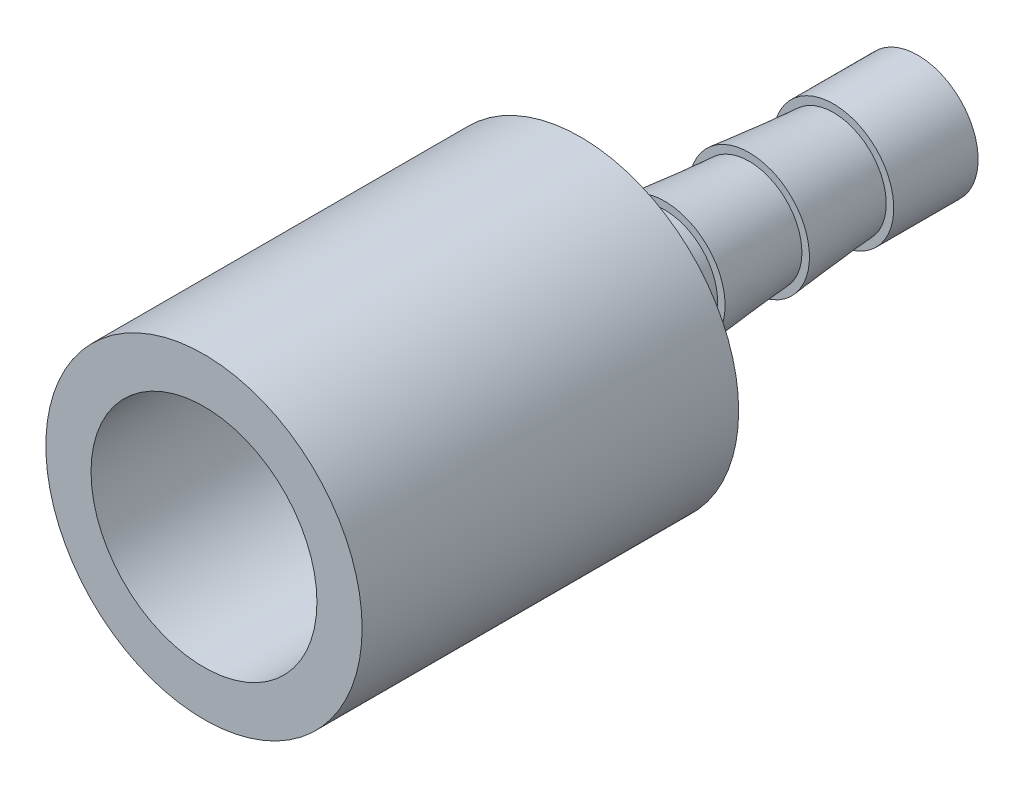
ISO-10303-21;
HEADER;
FILE_DESCRIPTION(('STEP AP214'),'2;1');
FILE_NAME('part.step','',(''),(''),'','','');
FILE_SCHEMA(('AUTOMOTIVE_DESIGN { 1 0 10303 214 1 1 1 1 }'));
ENDSEC;
DATA;
#1=APPLICATION_CONTEXT('core data for automotive mechanical design processes');
#2=APPLICATION_PROTOCOL_DEFINITION('international standard','automotive_design',2000,#1);
#3=PRODUCT_CONTEXT('',#1,'mechanical');
#4=PRODUCT('Part','Part','',(#3));
#5=PRODUCT_RELATED_PRODUCT_CATEGORY('part','',(#4));
#6=PRODUCT_DEFINITION_FORMATION('','',#4);
#7=PRODUCT_DEFINITION_CONTEXT('part definition',#1,'design');
#8=PRODUCT_DEFINITION('design','',#6,#7);
#9=PRODUCT_DEFINITION_SHAPE('','',#8);
#10=(LENGTH_UNIT() NAMED_UNIT(*) SI_UNIT(.MILLI.,.METRE.));
#11=(NAMED_UNIT(*) PLANE_ANGLE_UNIT() SI_UNIT($,.RADIAN.));
#12=(NAMED_UNIT(*) SI_UNIT($,.STERADIAN.) SOLID_ANGLE_UNIT());
#13=UNCERTAINTY_MEASURE_WITH_UNIT(LENGTH_MEASURE(1.E-05),#10,'distance_accuracy_value','');
#14=(GEOMETRIC_REPRESENTATION_CONTEXT(3) GLOBAL_UNCERTAINTY_ASSIGNED_CONTEXT((#13)) GLOBAL_UNIT_ASSIGNED_CONTEXT((#10,
#11,#12)) REPRESENTATION_CONTEXT('',''));
#15=CARTESIAN_POINT('',(0.,0.,0.));
#16=DIRECTION('',(0.,0.,1.));
#17=DIRECTION('',(1.,0.,0.));
#18=AXIS2_PLACEMENT_3D('',#15,#16,#17);
#19=CARTESIAN_POINT('',(0.,0.,25.));
#20=DIRECTION('',(0.,0.,-1.));
#21=DIRECTION('',(-1.,0.,0.));
#22=AXIS2_PLACEMENT_3D('',#19,#20,#21);
#23=CYLINDRICAL_SURFACE('',#22,7.5);
#24=CARTESIAN_POINT('',(0.,0.,25.));
#25=DIRECTION('',(0.,0.,1.));
#26=DIRECTION('',(1.,0.,0.));
#27=AXIS2_PLACEMENT_3D('',#24,#25,#26);
#28=CIRCLE('',#27,7.5);
#29=CARTESIAN_POINT('',(7.5,0.,25.));
#30=VERTEX_POINT('',#29);
#31=EDGE_CURVE('E58',#30,#30,#28,.T.);
#32=ORIENTED_EDGE('',*,*,#31,.T.);
#33=EDGE_LOOP('',(#32));
#34=FACE_BOUND('',#33,.T.);
#35=CARTESIAN_POINT('',(0.,0.,5.));
#36=DIRECTION('',(0.,0.,-1.));
#37=DIRECTION('',(-1.,0.,0.));
#38=AXIS2_PLACEMENT_3D('',#35,#36,#37);
#39=CIRCLE('',#38,7.5);
#40=CARTESIAN_POINT('',(-7.5,0.,5.));
#41=VERTEX_POINT('',#40);
#42=EDGE_CURVE('E63',#41,#41,#39,.T.);
#43=ORIENTED_EDGE('',*,*,#42,.T.);
#44=EDGE_LOOP('',(#43));
#45=FACE_BOUND('',#44,.T.);
#46=ADVANCED_FACE('F43',(#34,#45),#23,.F.);
#47=CARTESIAN_POINT('',(0.,0.,25.));
#48=DIRECTION('',(0.,0.,1.));
#49=DIRECTION('',(1.,0.,0.));
#50=AXIS2_PLACEMENT_3D('',#47,#48,#49);
#51=PLANE('',#50);
#52=CARTESIAN_POINT('',(0.,0.,25.));
#53=DIRECTION('',(0.,0.,1.));
#54=DIRECTION('',(1.,0.,0.));
#55=AXIS2_PLACEMENT_3D('',#52,#53,#54);
#56=CIRCLE('',#55,10.5);
#57=CARTESIAN_POINT('',(10.5,0.,25.));
#58=VERTEX_POINT('',#57);
#59=EDGE_CURVE('E11',#58,#58,#56,.T.);
#60=ORIENTED_EDGE('',*,*,#59,.T.);
#61=EDGE_LOOP('',(#60));
#62=FACE_BOUND('',#61,.T.);
#63=ORIENTED_EDGE('',*,*,#31,.F.);
#64=EDGE_LOOP('',(#63));
#65=FACE_BOUND('',#64,.T.);
#66=ADVANCED_FACE('F137',(#62,#65),#51,.T.);
#67=CARTESIAN_POINT('',(0.,0.,0.));
#68=DIRECTION('',(0.,0.,1.));
#69=DIRECTION('',(1.,0.,0.));
#70=AXIS2_PLACEMENT_3D('',#67,#68,#69);
#71=PLANE('',#70);
#72=CARTESIAN_POINT('',(0.,0.,0.));
#73=DIRECTION('',(0.,0.,-1.));
#74=DIRECTION('',(-1.,0.,0.));
#75=AXIS2_PLACEMENT_3D('',#72,#73,#74);
#76=CIRCLE('',#75,4.);
#77=CARTESIAN_POINT('',(-3.7218749285493,1.46548524940927,0.));
#78=VERTEX_POINT('',#77);
#79=EDGE_CURVE('E72',#78,#78,#76,.T.);
#80=ORIENTED_EDGE('',*,*,#79,.F.);
#81=EDGE_LOOP('',(#80));
#82=FACE_BOUND('',#81,.T.);
#83=CARTESIAN_POINT('',(0.,0.,0.));
#84=DIRECTION('',(0.,0.,1.));
#85=DIRECTION('',(1.,0.,0.));
#86=AXIS2_PLACEMENT_3D('',#83,#84,#85);
#87=CIRCLE('',#86,10.5);
#88=CARTESIAN_POINT('',(10.5,0.,0.));
#89=VERTEX_POINT('',#88);
#90=EDGE_CURVE('E52',#89,#89,#87,.T.);
#91=ORIENTED_EDGE('',*,*,#90,.F.);
#92=EDGE_LOOP('',(#91));
#93=FACE_BOUND('',#92,.T.);
#94=ADVANCED_FACE('F140',(#82,#93),#71,.F.);
#95=CARTESIAN_POINT('',(0.,0.,25.));
#96=DIRECTION('',(0.,0.,-1.));
#97=DIRECTION('',(-1.,0.,0.));
#98=AXIS2_PLACEMENT_3D('',#95,#96,#97);
#99=CYLINDRICAL_SURFACE('',#98,10.5);
#100=ORIENTED_EDGE('',*,*,#59,.F.);
#101=EDGE_LOOP('',(#100));
#102=FACE_BOUND('',#101,.T.);
#103=ORIENTED_EDGE('',*,*,#90,.T.);
#104=EDGE_LOOP('',(#103));
#105=FACE_BOUND('',#104,.T.);
#106=ADVANCED_FACE('F45',(#102,#105),#99,.T.);
#107=CARTESIAN_POINT('',(0.,0.,5.));
#108=DIRECTION('',(0.,0.,-1.));
#109=DIRECTION('',(-1.,0.,0.));
#110=AXIS2_PLACEMENT_3D('',#107,#108,#109);
#111=PLANE('',#110);
#112=CARTESIAN_POINT('',(0.,0.,5.));
#113=DIRECTION('',(0.,0.,-1.));
#114=DIRECTION('',(-1.,0.,0.));
#115=AXIS2_PLACEMENT_3D('',#112,#113,#114);
#116=CIRCLE('',#115,2.5);
#117=CARTESIAN_POINT('',(-2.5,0.,5.));
#118=VERTEX_POINT('',#117);
#119=EDGE_CURVE('E67',#118,#118,#116,.T.);
#120=ORIENTED_EDGE('',*,*,#119,.T.);
#121=EDGE_LOOP('',(#120));
#122=FACE_BOUND('',#121,.T.);
#123=ORIENTED_EDGE('',*,*,#42,.F.);
#124=EDGE_LOOP('',(#123));
#125=FACE_BOUND('',#124,.T.);
#126=ADVANCED_FACE('F130',(#122,#125),#111,.F.);
#127=CARTESIAN_POINT('',(0.,0.,5.));
#128=DIRECTION('',(0.,0.,-1.));
#129=DIRECTION('',(-1.,0.,0.));
#130=AXIS2_PLACEMENT_3D('',#127,#128,#129);
#131=CYLINDRICAL_SURFACE('',#130,2.5);
#132=ORIENTED_EDGE('',*,*,#119,.F.);
#133=EDGE_LOOP('',(#132));
#134=FACE_BOUND('',#133,.T.);
#135=CARTESIAN_POINT('',(0.,0.,0.));
#136=DIRECTION('',(0.,0.,-1.));
#137=DIRECTION('',(-1.,0.,0.));
#138=AXIS2_PLACEMENT_3D('',#135,#136,#137);
#139=CIRCLE('',#138,2.5);
#140=CARTESIAN_POINT('',(-2.5,0.,0.));
#141=VERTEX_POINT('',#140);
#142=EDGE_CURVE('E68',#141,#141,#139,.T.);
#143=ORIENTED_EDGE('',*,*,#142,.T.);
#144=EDGE_LOOP('',(#143));
#145=FACE_BOUND('',#144,.T.);
#146=ADVANCED_FACE('F118',(#134,#145),#131,.F.);
#147=CARTESIAN_POINT('',(-2.89824660862792,1.96218413905953,-5.6));
#148=CARTESIAN_POINT('',(-3.7218749285493,1.46548524940927,0.));
#149=CARTESIAN_POINT('',(-6.82261488674697,-3.8343090781963,-5.6));
#150=CARTESIAN_POINT('',(-6.65284542736783,-5.97826460768933,0.));
#151=CARTESIAN_POINT('',(-1.02612166949114,-7.75867735631536,-5.6));
#152=CARTESIAN_POINT('',(0.790904429730766,-8.90923510650786,0.));
#153=CARTESIAN_POINT('',(2.89824660862792,-1.96218413905953,-5.6));
#154=CARTESIAN_POINT('',(3.7218749285493,-1.46548524940927,0.));
#155=CARTESIAN_POINT('',(6.82261488674697,3.8343090781963,-5.6));
#156=CARTESIAN_POINT('',(6.65284542736783,5.97826460768933,0.));
#157=CARTESIAN_POINT('',(1.02612166949114,7.75867735631536,-5.6));
#158=CARTESIAN_POINT('',(-0.790904429730765,8.90923510650786,0.));
#159=CARTESIAN_POINT('',(-2.89824660862792,1.96218413905953,-5.6));
#160=CARTESIAN_POINT('',(-3.7218749285493,1.46548524940927,0.));
#161=(BOUNDED_SURFACE() B_SPLINE_SURFACE(3,1,((#147,#148),(#149,#150),(#151,#152),(#153,#154),
(#155,#156),(#157,#158),(#159,#160)),.UNSPECIFIED.,.T.,.F.,.F.) B_SPLINE_SURFACE_WITH_KNOTS((4,
3,4),(2,2),(0.,0.5,1.),(0.,1.),
.UNSPECIFIED.) GEOMETRIC_REPRESENTATION_ITEM() RATIONAL_B_SPLINE_SURFACE(((1.,1.),
(0.333333333333333,0.333333333333333),(0.333333333333333,0.333333333333333),(1.,1.),
(0.333333333333333,0.333333333333333),(0.333333333333333,0.333333333333333),(1.,1.))) REPRESENTATION_ITEM('') SURFACE());
#162=CARTESIAN_POINT('',(0.,0.,-5.6));
#163=DIRECTION('',(0.,0.,-1.));
#164=DIRECTION('',(-1.,0.,0.));
#165=AXIS2_PLACEMENT_3D('',#162,#163,#164);
#166=CIRCLE('',#165,3.5);
#167=CARTESIAN_POINT('',(-2.89824660862792,1.96218413905953,-5.6));
#168=VERTEX_POINT('',#167);
#169=EDGE_CURVE('E79',#168,#168,#166,.T.);
#170=CARTESIAN_POINT('',(-2.89824660862792,1.96218413905953,-5.6));
#171=CARTESIAN_POINT('',(-2.90682607029376,1.95701019229234,-5.54166666666667));
#172=CARTESIAN_POINT('',(-2.91540553195961,1.95183624552515,-5.48333333333333));
#173=CARTESIAN_POINT('',(-2.93256445529131,1.94148835199077,-5.36666666666667));
#174=CARTESIAN_POINT('',(-2.94114391695715,1.93631440522358,-5.30833333333333));
#175=CARTESIAN_POINT('',(-2.95830284028885,1.9259665116892,-5.19166666666667));
#176=CARTESIAN_POINT('',(-2.9668823019547,1.92079256492201,-5.13333333333333));
#177=CARTESIAN_POINT('',(-2.98404122528639,1.91044467138763,-5.01666666666667));
#178=CARTESIAN_POINT('',(-2.99262068695224,1.90527072462044,-4.95833333333333));
#179=CARTESIAN_POINT('',(-3.00977961028394,1.89492283108606,-4.84166666666667));
#180=CARTESIAN_POINT('',(-3.01835907194978,1.88974888431887,-4.78333333333333));
#181=CARTESIAN_POINT('',(-3.03551799528148,1.87940099078449,-4.66666666666667));
#182=CARTESIAN_POINT('',(-3.04409745694733,1.8742270440173,-4.60833333333333));
#183=CARTESIAN_POINT('',(-3.06125638027902,1.86387915048291,-4.49166666666667));
#184=CARTESIAN_POINT('',(-3.06983584194487,1.85870520371572,-4.43333333333333));
#185=CARTESIAN_POINT('',(-3.08699476527657,1.84835731018134,-4.31666666666667));
#186=CARTESIAN_POINT('',(-3.09557422694241,1.84318336341415,-4.25833333333333));
#187=CARTESIAN_POINT('',(-3.11273315027411,1.83283546987977,-4.14166666666667));
#188=CARTESIAN_POINT('',(-3.12131261193996,1.82766152311258,-4.08333333333333));
#189=CARTESIAN_POINT('',(-3.13847153527165,1.8173136295782,-3.96666666666667));
#190=CARTESIAN_POINT('',(-3.1470509969375,1.81213968281101,-3.90833333333333));
#191=CARTESIAN_POINT('',(-3.1642099202692,1.80179178927663,-3.79166666666667));
#192=CARTESIAN_POINT('',(-3.17278938193504,1.79661784250944,-3.73333333333333));
#193=CARTESIAN_POINT('',(-3.18994830526674,1.78626994897506,-3.61666666666667));
#194=CARTESIAN_POINT('',(-3.19852776693259,1.78109600220787,-3.55833333333333));
#195=CARTESIAN_POINT('',(-3.21568669026428,1.77074810867349,-3.44166666666667));
#196=CARTESIAN_POINT('',(-3.22426615193013,1.7655741619063,-3.38333333333333));
#197=CARTESIAN_POINT('',(-3.24142507526183,1.75522626837192,-3.26666666666667));
#198=CARTESIAN_POINT('',(-3.25000453692767,1.75005232160473,-3.20833333333333));
#199=CARTESIAN_POINT('',(-3.26716346025937,1.73970442807035,-3.09166666666667));
#200=CARTESIAN_POINT('',(-3.27574292192522,1.73453048130316,-3.03333333333333));
#201=CARTESIAN_POINT('',(-3.29290184525691,1.72418258776878,-2.91666666666667));
#202=CARTESIAN_POINT('',(-3.30148130692276,1.71900864100159,-2.85833333333333));
#203=CARTESIAN_POINT('',(-3.31864023025446,1.70866074746721,-2.74166666666667));
#204=CARTESIAN_POINT('',(-3.3272196919203,1.70348680070002,-2.68333333333333));
#205=CARTESIAN_POINT('',(-3.344378615252,1.69313890716564,-2.56666666666667));
#206=CARTESIAN_POINT('',(-3.35295807691785,1.68796496039845,-2.50833333333333));
#207=CARTESIAN_POINT('',(-3.37011700024954,1.67761706686407,-2.39166666666667));
#208=CARTESIAN_POINT('',(-3.37869646191539,1.67244312009688,-2.33333333333333));
#209=CARTESIAN_POINT('',(-3.39585538524709,1.6620952265625,-2.21666666666667));
#210=CARTESIAN_POINT('',(-3.40443484691293,1.65692127979531,-2.15833333333333));
#211=CARTESIAN_POINT('',(-3.42159377024463,1.64657338626093,-2.04166666666667));
#212=CARTESIAN_POINT('',(-3.43017323191048,1.64139943949374,-1.98333333333333));
#213=CARTESIAN_POINT('',(-3.44733215524217,1.63105154595935,-1.86666666666667));
#214=CARTESIAN_POINT('',(-3.45591161690802,1.62587759919216,-1.80833333333333));
#215=CARTESIAN_POINT('',(-3.47307054023972,1.61552970565778,-1.69166666666667));
#216=CARTESIAN_POINT('',(-3.48165000190556,1.61035575889059,-1.63333333333333));
#217=CARTESIAN_POINT('',(-3.49880892523726,1.60000786535621,-1.51666666666667));
#218=CARTESIAN_POINT('',(-3.50738838690311,1.59483391858902,-1.45833333333333));
#219=CARTESIAN_POINT('',(-3.5245473102348,1.58448602505464,-1.34166666666667));
#220=CARTESIAN_POINT('',(-3.53312677190065,1.57931207828745,-1.28333333333333));
#221=CARTESIAN_POINT('',(-3.55028569523235,1.56896418475307,-1.16666666666667));
#222=CARTESIAN_POINT('',(-3.55886515689819,1.56379023798588,-1.10833333333333));
#223=CARTESIAN_POINT('',(-3.57602408022989,1.5534423444515,-0.991666666666667));
#224=CARTESIAN_POINT('',(-3.58460354189574,1.54826839768431,-0.933333333333333));
#225=CARTESIAN_POINT('',(-3.60176246522743,1.53792050414993,-0.816666666666667));
#226=CARTESIAN_POINT('',(-3.61034192689328,1.53274655738274,-0.758333333333333));
#227=CARTESIAN_POINT('',(-3.62750085022497,1.52239866384836,-0.641666666666667));
#228=CARTESIAN_POINT('',(-3.63608031189082,1.51722471708117,-0.583333333333333));
#229=CARTESIAN_POINT('',(-3.65323923522252,1.50687682354679,-0.466666666666667));
#230=CARTESIAN_POINT('',(-3.66181869688837,1.5017028767796,-0.408333333333333));
#231=CARTESIAN_POINT('',(-3.67897762022006,1.49135498324522,-0.291666666666667));
#232=CARTESIAN_POINT('',(-3.68755708188591,1.48618103647803,-0.233333333333333));
#233=CARTESIAN_POINT('',(-3.7047160052176,1.47583314294365,-0.116666666666667));
#234=CARTESIAN_POINT('',(-3.71329546688345,1.47065919617646,-0.0583333333333333));
#235=CARTESIAN_POINT('',(-3.7218749285493,1.46548524940927,0.));
#236=B_SPLINE_CURVE_WITH_KNOTS('',3,(#170,#171,#172,#173,#174,#175,#176,#177,#178,#179,#180,
#181,#182,#183,#184,#185,#186,#187,#188,#189,#190,#191,#192,#193,#194,#195,#196,#197,#198,#199,
#200,#201,#202,#203,#204,#205,#206,#207,#208,#209,#210,#211,#212,#213,#214,#215,#216,#217,#218,
#219,#220,#221,#222,#223,#224,#225,#226,#227,#228,#229,#230,#231,#232,#233,#234,#235),
.UNSPECIFIED.,.F.,.F.,(4,2,2,2,2,2,2,2,2,2,2,2,2,2,2,2,2,2,2,2,2,2,2,2,2,2,2,2,2,2,2,2,4),(0.,
0.177562360844378,0.355124721688756,0.532687082533135,0.710249443377514,0.887811804221892,
1.06537416506627,1.24293652591065,1.42049888675503,1.5980612475994,1.77562360844378,
1.95318596928816,2.13074833013254,2.30831069097692,2.4858730518213,2.66343541266568,
2.84099777351005,3.01856013435443,3.19612249519881,3.37368485604319,3.55124721688757,
3.72880957773195,3.90637193857632,4.0839342994207,4.26149666026508,4.43905902110946,
4.61662138195384,4.79418374279822,4.9717461036426,5.14930846448697,5.32687082533135,
5.50443318617573,5.68199554702011),.UNSPECIFIED.);
#237=EDGE_CURVE('BSEAM113',#168,#78,#236,.T.);
#238=ORIENTED_EDGE('',*,*,#169,.F.);
#239=ORIENTED_EDGE('',*,*,#79,.T.);
#240=ORIENTED_EDGE('',*,*,#237,.T.);
#241=ORIENTED_EDGE('',*,*,#237,.F.);
#242=EDGE_LOOP('',(#238,#240,#239,#241));
#243=FACE_BOUND('',#242,.T.);
#244=ADVANCED_FACE('F113',(#243),#161,.T.);
#245=CARTESIAN_POINT('',(0.,0.,0.));
#246=DIRECTION('',(0.,0.,-1.));
#247=DIRECTION('',(-1.,0.,0.));
#248=AXIS2_PLACEMENT_3D('',#245,#246,#247);
#249=PLANE('',#248);
#250=CARTESIAN_POINT('',(0.,0.,0.));
#251=DIRECTION('',(0.,0.,-1.));
#252=DIRECTION('',(-1.,0.,0.));
#253=AXIS2_PLACEMENT_3D('',#250,#251,#252);
#254=CIRCLE('',#253,2.);
#255=CARTESIAN_POINT('',(-2.,0.,0.));
#256=VERTEX_POINT('',#255);
#257=EDGE_CURVE('E337',#256,#256,#254,.T.);
#258=ORIENTED_EDGE('',*,*,#257,.T.);
#259=EDGE_LOOP('',(#258));
#260=FACE_BOUND('',#259,.T.);
#261=ORIENTED_EDGE('',*,*,#142,.F.);
#262=EDGE_LOOP('',(#261));
#263=FACE_BOUND('',#262,.T.);
#264=ADVANCED_FACE('F107',(#260,#263),#249,.F.);
#265=CARTESIAN_POINT('',(0.,0.,-5.6));
#266=DIRECTION('',(0.,0.,-1.));
#267=DIRECTION('',(-1.,0.,0.));
#268=AXIS2_PLACEMENT_3D('',#265,#266,#267);
#269=PLANE('',#268);
#270=CARTESIAN_POINT('',(0.,0.,-5.6));
#271=DIRECTION('',(0.,0.,-1.));
#272=DIRECTION('',(-1.,0.,0.));
#273=AXIS2_PLACEMENT_3D('',#270,#271,#272);
#274=CIRCLE('',#273,4.);
#275=CARTESIAN_POINT('',(-3.7218749285493,1.46548524940927,-5.6));
#276=VERTEX_POINT('',#275);
#277=EDGE_CURVE('E83',#276,#276,#274,.T.);
#278=ORIENTED_EDGE('',*,*,#277,.F.);
#279=EDGE_LOOP('',(#278));
#280=FACE_BOUND('',#279,.T.);
#281=ORIENTED_EDGE('',*,*,#169,.T.);
#282=EDGE_LOOP('',(#281));
#283=FACE_BOUND('',#282,.T.);
#284=ADVANCED_FACE('F96',(#280,#283),#269,.F.);
#285=CARTESIAN_POINT('',(-2.89824660862792,1.96218413905953,-11.2));
#286=CARTESIAN_POINT('',(-3.7218749285493,1.46548524940927,-5.6));
#287=CARTESIAN_POINT('',(-6.82261488674697,-3.8343090781963,-11.2));
#288=CARTESIAN_POINT('',(-6.65284542736783,-5.97826460768933,-5.6));
#289=CARTESIAN_POINT('',(-1.02612166949114,-7.75867735631536,-11.2));
#290=CARTESIAN_POINT('',(0.790904429730766,-8.90923510650786,-5.6));
#291=CARTESIAN_POINT('',(2.89824660862792,-1.96218413905953,-11.2));
#292=CARTESIAN_POINT('',(3.7218749285493,-1.46548524940927,-5.6));
#293=CARTESIAN_POINT('',(6.82261488674697,3.8343090781963,-11.2));
#294=CARTESIAN_POINT('',(6.65284542736783,5.97826460768933,-5.6));
#295=CARTESIAN_POINT('',(1.02612166949114,7.75867735631536,-11.2));
#296=CARTESIAN_POINT('',(-0.790904429730765,8.90923510650786,-5.6));
#297=CARTESIAN_POINT('',(-2.89824660862792,1.96218413905953,-11.2));
#298=CARTESIAN_POINT('',(-3.7218749285493,1.46548524940927,-5.6));
#299=(BOUNDED_SURFACE() B_SPLINE_SURFACE(3,1,((#285,#286),(#287,#288),(#289,#290),(#291,#292),
(#293,#294),(#295,#296),(#297,#298)),.UNSPECIFIED.,.T.,.F.,.F.) B_SPLINE_SURFACE_WITH_KNOTS((4,
3,4),(2,2),(0.,0.5,1.),(0.,1.),
.UNSPECIFIED.) GEOMETRIC_REPRESENTATION_ITEM() RATIONAL_B_SPLINE_SURFACE(((1.,1.),
(0.333333333333333,0.333333333333333),(0.333333333333333,0.333333333333333),(1.,1.),
(0.333333333333333,0.333333333333333),(0.333333333333333,0.333333333333333),(1.,1.))) REPRESENTATION_ITEM('') SURFACE());
#300=CARTESIAN_POINT('',(0.,0.,-11.2));
#301=DIRECTION('',(0.,0.,-1.));
#302=DIRECTION('',(-1.,0.,0.));
#303=AXIS2_PLACEMENT_3D('',#300,#301,#302);
#304=CIRCLE('',#303,3.5);
#305=CARTESIAN_POINT('',(-2.89824660862792,1.96218413905953,-11.2));
#306=VERTEX_POINT('',#305);
#307=EDGE_CURVE('E89',#306,#306,#304,.T.);
#308=CARTESIAN_POINT('',(-2.89824660862792,1.96218413905953,-11.2));
#309=CARTESIAN_POINT('',(-2.90682607029376,1.95701019229234,-11.1416666666667));
#310=CARTESIAN_POINT('',(-2.91540553195961,1.95183624552515,-11.0833333333333));
#311=CARTESIAN_POINT('',(-2.93256445529131,1.94148835199077,-10.9666666666667));
#312=CARTESIAN_POINT('',(-2.94114391695715,1.93631440522358,-10.9083333333333));
#313=CARTESIAN_POINT('',(-2.95830284028885,1.9259665116892,-10.7916666666667));
#314=CARTESIAN_POINT('',(-2.9668823019547,1.92079256492201,-10.7333333333333));
#315=CARTESIAN_POINT('',(-2.98404122528639,1.91044467138763,-10.6166666666667));
#316=CARTESIAN_POINT('',(-2.99262068695224,1.90527072462044,-10.5583333333333));
#317=CARTESIAN_POINT('',(-3.00977961028394,1.89492283108606,-10.4416666666667));
#318=CARTESIAN_POINT('',(-3.01835907194978,1.88974888431887,-10.3833333333333));
#319=CARTESIAN_POINT('',(-3.03551799528148,1.87940099078449,-10.2666666666667));
#320=CARTESIAN_POINT('',(-3.04409745694733,1.87422704401729,-10.2083333333333));
#321=CARTESIAN_POINT('',(-3.06125638027902,1.86387915048291,-10.0916666666667));
#322=CARTESIAN_POINT('',(-3.06983584194487,1.85870520371572,-10.0333333333333));
#323=CARTESIAN_POINT('',(-3.08699476527657,1.84835731018134,-9.91666666666667));
#324=CARTESIAN_POINT('',(-3.09557422694241,1.84318336341415,-9.85833333333333));
#325=CARTESIAN_POINT('',(-3.11273315027411,1.83283546987977,-9.74166666666667));
#326=CARTESIAN_POINT('',(-3.12131261193996,1.82766152311258,-9.68333333333333));
#327=CARTESIAN_POINT('',(-3.13847153527165,1.8173136295782,-9.56666666666667));
#328=CARTESIAN_POINT('',(-3.1470509969375,1.81213968281101,-9.50833333333333));
#329=CARTESIAN_POINT('',(-3.1642099202692,1.80179178927663,-9.39166666666667));
#330=CARTESIAN_POINT('',(-3.17278938193504,1.79661784250944,-9.33333333333333));
#331=CARTESIAN_POINT('',(-3.18994830526674,1.78626994897506,-9.21666666666667));
#332=CARTESIAN_POINT('',(-3.19852776693259,1.78109600220787,-9.15833333333333));
#333=CARTESIAN_POINT('',(-3.21568669026428,1.77074810867349,-9.04166666666667));
#334=CARTESIAN_POINT('',(-3.22426615193013,1.7655741619063,-8.98333333333333));
#335=CARTESIAN_POINT('',(-3.24142507526183,1.75522626837192,-8.86666666666667));
#336=CARTESIAN_POINT('',(-3.25000453692767,1.75005232160473,-8.80833333333333));
#337=CARTESIAN_POINT('',(-3.26716346025937,1.73970442807035,-8.69166666666667));
#338=CARTESIAN_POINT('',(-3.27574292192522,1.73453048130316,-8.63333333333333));
#339=CARTESIAN_POINT('',(-3.29290184525691,1.72418258776878,-8.51666666666667));
#340=CARTESIAN_POINT('',(-3.30148130692276,1.71900864100159,-8.45833333333333));
#341=CARTESIAN_POINT('',(-3.31864023025446,1.70866074746721,-8.34166666666667));
#342=CARTESIAN_POINT('',(-3.3272196919203,1.70348680070002,-8.28333333333333));
#343=CARTESIAN_POINT('',(-3.344378615252,1.69313890716564,-8.16666666666667));
#344=CARTESIAN_POINT('',(-3.35295807691785,1.68796496039845,-8.10833333333333));
#345=CARTESIAN_POINT('',(-3.37011700024954,1.67761706686407,-7.99166666666667));
#346=CARTESIAN_POINT('',(-3.37869646191539,1.67244312009688,-7.93333333333333));
#347=CARTESIAN_POINT('',(-3.39585538524709,1.6620952265625,-7.81666666666667));
#348=CARTESIAN_POINT('',(-3.40443484691293,1.65692127979531,-7.75833333333333));
#349=CARTESIAN_POINT('',(-3.42159377024463,1.64657338626093,-7.64166666666667));
#350=CARTESIAN_POINT('',(-3.43017323191048,1.64139943949374,-7.58333333333333));
#351=CARTESIAN_POINT('',(-3.44733215524217,1.63105154595935,-7.46666666666667));
#352=CARTESIAN_POINT('',(-3.45591161690802,1.62587759919216,-7.40833333333333));
#353=CARTESIAN_POINT('',(-3.47307054023972,1.61552970565778,-7.29166666666667));
#354=CARTESIAN_POINT('',(-3.48165000190556,1.61035575889059,-7.23333333333333));
#355=CARTESIAN_POINT('',(-3.49880892523726,1.60000786535621,-7.11666666666667));
#356=CARTESIAN_POINT('',(-3.50738838690311,1.59483391858902,-7.05833333333333));
#357=CARTESIAN_POINT('',(-3.5245473102348,1.58448602505464,-6.94166666666667));
#358=CARTESIAN_POINT('',(-3.53312677190065,1.57931207828745,-6.88333333333333));
#359=CARTESIAN_POINT('',(-3.55028569523235,1.56896418475307,-6.76666666666667));
#360=CARTESIAN_POINT('',(-3.55886515689819,1.56379023798588,-6.70833333333333));
#361=CARTESIAN_POINT('',(-3.57602408022989,1.5534423444515,-6.59166666666667));
#362=CARTESIAN_POINT('',(-3.58460354189574,1.54826839768431,-6.53333333333333));
#363=CARTESIAN_POINT('',(-3.60176246522743,1.53792050414993,-6.41666666666667));
#364=CARTESIAN_POINT('',(-3.61034192689328,1.53274655738274,-6.35833333333333));
#365=CARTESIAN_POINT('',(-3.62750085022497,1.52239866384836,-6.24166666666667));
#366=CARTESIAN_POINT('',(-3.63608031189082,1.51722471708117,-6.18333333333333));
#367=CARTESIAN_POINT('',(-3.65323923522252,1.50687682354679,-6.06666666666667));
#368=CARTESIAN_POINT('',(-3.66181869688837,1.5017028767796,-6.00833333333333));
#369=CARTESIAN_POINT('',(-3.67897762022006,1.49135498324522,-5.89166666666667));
#370=CARTESIAN_POINT('',(-3.68755708188591,1.48618103647803,-5.83333333333333));
#371=CARTESIAN_POINT('',(-3.7047160052176,1.47583314294365,-5.71666666666667));
#372=CARTESIAN_POINT('',(-3.71329546688345,1.47065919617646,-5.65833333333333));
#373=CARTESIAN_POINT('',(-3.7218749285493,1.46548524940927,-5.6));
#374=B_SPLINE_CURVE_WITH_KNOTS('',3,(#308,#309,#310,#311,#312,#313,#314,#315,#316,#317,#318,
#319,#320,#321,#322,#323,#324,#325,#326,#327,#328,#329,#330,#331,#332,#333,#334,#335,#336,#337,
#338,#339,#340,#341,#342,#343,#344,#345,#346,#347,#348,#349,#350,#351,#352,#353,#354,#355,#356,
#357,#358,#359,#360,#361,#362,#363,#364,#365,#366,#367,#368,#369,#370,#371,#372,#373),
.UNSPECIFIED.,.F.,.F.,(4,2,2,2,2,2,2,2,2,2,2,2,2,2,2,2,2,2,2,2,2,2,2,2,2,2,2,2,2,2,2,2,4),(0.,
0.177562360844378,0.355124721688756,0.532687082533136,0.710249443377514,0.887811804221891,
1.06537416506627,1.24293652591065,1.42049888675503,1.5980612475994,1.77562360844378,
1.95318596928816,2.13074833013254,2.30831069097692,2.4858730518213,2.66343541266568,
2.84099777351005,3.01856013435443,3.19612249519881,3.37368485604319,3.55124721688757,
3.72880957773195,3.90637193857632,4.0839342994207,4.26149666026508,4.43905902110946,
4.61662138195384,4.79418374279822,4.97174610364259,5.14930846448697,5.32687082533135,
5.50443318617573,5.68199554702011),.UNSPECIFIED.);
#375=EDGE_CURVE('BSEAM106',#306,#276,#374,.T.);
#376=ORIENTED_EDGE('',*,*,#307,.F.);
#377=ORIENTED_EDGE('',*,*,#277,.T.);
#378=ORIENTED_EDGE('',*,*,#375,.T.);
#379=ORIENTED_EDGE('',*,*,#375,.F.);
#380=EDGE_LOOP('',(#376,#378,#377,#379));
#381=FACE_BOUND('',#380,.T.);
#382=ADVANCED_FACE('F106',(#381),#299,.T.);
#383=CARTESIAN_POINT('',(0.,0.,-11.2));
#384=DIRECTION('',(0.,0.,-1.));
#385=DIRECTION('',(-1.,0.,0.));
#386=AXIS2_PLACEMENT_3D('',#383,#384,#385);
#387=PLANE('',#386);
#388=CARTESIAN_POINT('',(0.,0.,-11.2));
#389=DIRECTION('',(0.,0.,-1.));
#390=DIRECTION('',(-1.,0.,0.));
#391=AXIS2_PLACEMENT_3D('',#388,#389,#390);
#392=CIRCLE('',#391,4.);
#393=CARTESIAN_POINT('',(-3.7218749285493,1.46548524940927,-11.2));
#394=VERTEX_POINT('',#393);
#395=EDGE_CURVE('E301',#394,#394,#392,.T.);
#396=ORIENTED_EDGE('',*,*,#395,.F.);
#397=EDGE_LOOP('',(#396));
#398=FACE_BOUND('',#397,.T.);
#399=ORIENTED_EDGE('',*,*,#307,.T.);
#400=EDGE_LOOP('',(#399));
#401=FACE_BOUND('',#400,.T.);
#402=ADVANCED_FACE('F184',(#398,#401),#387,.F.);
#403=CARTESIAN_POINT('',(-2.89824660862792,1.96218413905953,-16.8));
#404=CARTESIAN_POINT('',(-3.7218749285493,1.46548524940927,-11.2));
#405=CARTESIAN_POINT('',(-6.82261488674697,-3.8343090781963,-16.8));
#406=CARTESIAN_POINT('',(-6.65284542736783,-5.97826460768933,-11.2));
#407=CARTESIAN_POINT('',(-1.02612166949114,-7.75867735631536,-16.8));
#408=CARTESIAN_POINT('',(0.790904429730766,-8.90923510650786,-11.2));
#409=CARTESIAN_POINT('',(2.89824660862792,-1.96218413905953,-16.8));
#410=CARTESIAN_POINT('',(3.7218749285493,-1.46548524940927,-11.2));
#411=CARTESIAN_POINT('',(6.82261488674697,3.8343090781963,-16.8));
#412=CARTESIAN_POINT('',(6.65284542736783,5.97826460768933,-11.2));
#413=CARTESIAN_POINT('',(1.02612166949114,7.75867735631536,-16.8));
#414=CARTESIAN_POINT('',(-0.790904429730765,8.90923510650786,-11.2));
#415=CARTESIAN_POINT('',(-2.89824660862792,1.96218413905953,-16.8));
#416=CARTESIAN_POINT('',(-3.7218749285493,1.46548524940927,-11.2));
#417=(BOUNDED_SURFACE() B_SPLINE_SURFACE(3,1,((#403,#404),(#405,#406),(#407,#408),(#409,#410),
(#411,#412),(#413,#414),(#415,#416)),.UNSPECIFIED.,.T.,.F.,.F.) B_SPLINE_SURFACE_WITH_KNOTS((4,
3,4),(2,2),(0.,0.5,1.),(0.,1.),
.UNSPECIFIED.) GEOMETRIC_REPRESENTATION_ITEM() RATIONAL_B_SPLINE_SURFACE(((1.,1.),
(0.333333333333333,0.333333333333333),(0.333333333333333,0.333333333333333),(1.,1.),
(0.333333333333333,0.333333333333333),(0.333333333333333,0.333333333333333),(1.,1.))) REPRESENTATION_ITEM('') SURFACE());
#418=CARTESIAN_POINT('',(0.,0.,-16.8));
#419=DIRECTION('',(0.,0.,-1.));
#420=DIRECTION('',(-1.,0.,0.));
#421=AXIS2_PLACEMENT_3D('',#418,#419,#420);
#422=CIRCLE('',#421,3.5);
#423=CARTESIAN_POINT('',(-2.89824660862792,1.96218413905953,-16.8));
#424=VERTEX_POINT('',#423);
#425=EDGE_CURVE('E292',#424,#424,#422,.T.);
#426=CARTESIAN_POINT('',(-2.89824660862792,1.96218413905953,-16.8));
#427=CARTESIAN_POINT('',(-2.90682607029376,1.95701019229234,-16.7416666666667));
#428=CARTESIAN_POINT('',(-2.91540553195961,1.95183624552515,-16.6833333333333));
#429=CARTESIAN_POINT('',(-2.93256445529131,1.94148835199077,-16.5666666666667));
#430=CARTESIAN_POINT('',(-2.94114391695715,1.93631440522358,-16.5083333333333));
#431=CARTESIAN_POINT('',(-2.95830284028885,1.9259665116892,-16.3916666666667));
#432=CARTESIAN_POINT('',(-2.9668823019547,1.92079256492201,-16.3333333333333));
#433=CARTESIAN_POINT('',(-2.98404122528639,1.91044467138763,-16.2166666666667));
#434=CARTESIAN_POINT('',(-2.99262068695224,1.90527072462044,-16.1583333333333));
#435=CARTESIAN_POINT('',(-3.00977961028394,1.89492283108606,-16.0416666666667));
#436=CARTESIAN_POINT('',(-3.01835907194978,1.88974888431887,-15.9833333333333));
#437=CARTESIAN_POINT('',(-3.03551799528148,1.87940099078449,-15.8666666666667));
#438=CARTESIAN_POINT('',(-3.04409745694733,1.87422704401729,-15.8083333333333));
#439=CARTESIAN_POINT('',(-3.06125638027902,1.86387915048291,-15.6916666666667));
#440=CARTESIAN_POINT('',(-3.06983584194487,1.85870520371572,-15.6333333333333));
#441=CARTESIAN_POINT('',(-3.08699476527657,1.84835731018134,-15.5166666666667));
#442=CARTESIAN_POINT('',(-3.09557422694241,1.84318336341415,-15.4583333333333));
#443=CARTESIAN_POINT('',(-3.11273315027411,1.83283546987977,-15.3416666666667));
#444=CARTESIAN_POINT('',(-3.12131261193996,1.82766152311258,-15.2833333333333));
#445=CARTESIAN_POINT('',(-3.13847153527165,1.8173136295782,-15.1666666666667));
#446=CARTESIAN_POINT('',(-3.1470509969375,1.81213968281101,-15.1083333333333));
#447=CARTESIAN_POINT('',(-3.1642099202692,1.80179178927663,-14.9916666666667));
#448=CARTESIAN_POINT('',(-3.17278938193504,1.79661784250944,-14.9333333333333));
#449=CARTESIAN_POINT('',(-3.18994830526674,1.78626994897506,-14.8166666666667));
#450=CARTESIAN_POINT('',(-3.19852776693259,1.78109600220787,-14.7583333333333));
#451=CARTESIAN_POINT('',(-3.21568669026428,1.77074810867349,-14.6416666666667));
#452=CARTESIAN_POINT('',(-3.22426615193013,1.7655741619063,-14.5833333333333));
#453=CARTESIAN_POINT('',(-3.24142507526183,1.75522626837192,-14.4666666666667));
#454=CARTESIAN_POINT('',(-3.25000453692767,1.75005232160473,-14.4083333333333));
#455=CARTESIAN_POINT('',(-3.26716346025937,1.73970442807035,-14.2916666666667));
#456=CARTESIAN_POINT('',(-3.27574292192522,1.73453048130316,-14.2333333333333));
#457=CARTESIAN_POINT('',(-3.29290184525691,1.72418258776878,-14.1166666666667));
#458=CARTESIAN_POINT('',(-3.30148130692276,1.71900864100159,-14.0583333333333));
#459=CARTESIAN_POINT('',(-3.31864023025446,1.70866074746721,-13.9416666666667));
#460=CARTESIAN_POINT('',(-3.3272196919203,1.70348680070002,-13.8833333333333));
#461=CARTESIAN_POINT('',(-3.344378615252,1.69313890716564,-13.7666666666667));
#462=CARTESIAN_POINT('',(-3.35295807691785,1.68796496039845,-13.7083333333333));
#463=CARTESIAN_POINT('',(-3.37011700024954,1.67761706686407,-13.5916666666667));
#464=CARTESIAN_POINT('',(-3.37869646191539,1.67244312009688,-13.5333333333333));
#465=CARTESIAN_POINT('',(-3.39585538524709,1.6620952265625,-13.4166666666667));
#466=CARTESIAN_POINT('',(-3.40443484691293,1.65692127979531,-13.3583333333333));
#467=CARTESIAN_POINT('',(-3.42159377024463,1.64657338626093,-13.2416666666667));
#468=CARTESIAN_POINT('',(-3.43017323191048,1.64139943949374,-13.1833333333333));
#469=CARTESIAN_POINT('',(-3.44733215524217,1.63105154595935,-13.0666666666667));
#470=CARTESIAN_POINT('',(-3.45591161690802,1.62587759919216,-13.0083333333333));
#471=CARTESIAN_POINT('',(-3.47307054023972,1.61552970565778,-12.8916666666667));
#472=CARTESIAN_POINT('',(-3.48165000190556,1.61035575889059,-12.8333333333333));
#473=CARTESIAN_POINT('',(-3.49880892523726,1.60000786535621,-12.7166666666667));
#474=CARTESIAN_POINT('',(-3.50738838690311,1.59483391858902,-12.6583333333333));
#475=CARTESIAN_POINT('',(-3.5245473102348,1.58448602505464,-12.5416666666667));
#476=CARTESIAN_POINT('',(-3.53312677190065,1.57931207828745,-12.4833333333333));
#477=CARTESIAN_POINT('',(-3.55028569523235,1.56896418475307,-12.3666666666667));
#478=CARTESIAN_POINT('',(-3.55886515689819,1.56379023798588,-12.3083333333333));
#479=CARTESIAN_POINT('',(-3.57602408022989,1.5534423444515,-12.1916666666667));
#480=CARTESIAN_POINT('',(-3.58460354189574,1.54826839768431,-12.1333333333333));
#481=CARTESIAN_POINT('',(-3.60176246522743,1.53792050414993,-12.0166666666667));
#482=CARTESIAN_POINT('',(-3.61034192689328,1.53274655738274,-11.9583333333333));
#483=CARTESIAN_POINT('',(-3.62750085022497,1.52239866384836,-11.8416666666667));
#484=CARTESIAN_POINT('',(-3.63608031189082,1.51722471708117,-11.7833333333333));
#485=CARTESIAN_POINT('',(-3.65323923522252,1.50687682354679,-11.6666666666667));
#486=CARTESIAN_POINT('',(-3.66181869688837,1.5017028767796,-11.6083333333333));
#487=CARTESIAN_POINT('',(-3.67897762022006,1.49135498324522,-11.4916666666667));
#488=CARTESIAN_POINT('',(-3.68755708188591,1.48618103647803,-11.4333333333333));
#489=CARTESIAN_POINT('',(-3.7047160052176,1.47583314294365,-11.3166666666667));
#490=CARTESIAN_POINT('',(-3.71329546688345,1.47065919617646,-11.2583333333333));
#491=CARTESIAN_POINT('',(-3.7218749285493,1.46548524940927,-11.2));
#492=B_SPLINE_CURVE_WITH_KNOTS('',3,(#426,#427,#428,#429,#430,#431,#432,#433,#434,#435,#436,
#437,#438,#439,#440,#441,#442,#443,#444,#445,#446,#447,#448,#449,#450,#451,#452,#453,#454,#455,
#456,#457,#458,#459,#460,#461,#462,#463,#464,#465,#466,#467,#468,#469,#470,#471,#472,#473,#474,
#475,#476,#477,#478,#479,#480,#481,#482,#483,#484,#485,#486,#487,#488,#489,#490,#491),
.UNSPECIFIED.,.F.,.F.,(4,2,2,2,2,2,2,2,2,2,2,2,2,2,2,2,2,2,2,2,2,2,2,2,2,2,2,2,2,2,2,2,4),(0.,
0.17756236084438,0.355124721688756,0.532687082533136,0.710249443377513,0.887811804221893,
1.06537416506627,1.24293652591065,1.42049888675503,1.5980612475994,1.77562360844378,
1.95318596928816,2.13074833013254,2.30831069097692,2.4858730518213,2.66343541266567,
2.84099777351005,3.01856013435443,3.19612249519881,3.37368485604319,3.55124721688757,
3.72880957773195,3.90637193857632,4.0839342994207,4.26149666026508,4.43905902110946,
4.61662138195384,4.79418374279822,4.97174610364259,5.14930846448697,5.32687082533135,
5.50443318617573,5.6819955470201),.UNSPECIFIED.);
#493=EDGE_CURVE('BSEAM191',#424,#394,#492,.T.);
#494=ORIENTED_EDGE('',*,*,#425,.F.);
#495=ORIENTED_EDGE('',*,*,#395,.T.);
#496=ORIENTED_EDGE('',*,*,#493,.T.);
#497=ORIENTED_EDGE('',*,*,#493,.F.);
#498=EDGE_LOOP('',(#494,#496,#495,#497));
#499=FACE_BOUND('',#498,.T.);
#500=ADVANCED_FACE('F191',(#499),#417,.T.);
#501=CARTESIAN_POINT('',(0.,0.,-16.8));
#502=DIRECTION('',(0.,0.,-1.));
#503=DIRECTION('',(-1.,0.,0.));
#504=AXIS2_PLACEMENT_3D('',#501,#502,#503);
#505=PLANE('',#504);
#506=CARTESIAN_POINT('',(0.,0.,-16.8));
#507=DIRECTION('',(0.,0.,-1.));
#508=DIRECTION('',(-1.,0.,0.));
#509=AXIS2_PLACEMENT_3D('',#506,#507,#508);
#510=CIRCLE('',#509,4.);
#511=CARTESIAN_POINT('',(-4.,0.,-16.8));
#512=VERTEX_POINT('',#511);
#513=EDGE_CURVE('E333',#512,#512,#510,.T.);
#514=ORIENTED_EDGE('',*,*,#513,.F.);
#515=EDGE_LOOP('',(#514));
#516=FACE_BOUND('',#515,.T.);
#517=ORIENTED_EDGE('',*,*,#425,.T.);
#518=EDGE_LOOP('',(#517));
#519=FACE_BOUND('',#518,.T.);
#520=ADVANCED_FACE('F198',(#516,#519),#505,.F.);
#521=CARTESIAN_POINT('',(0.,0.,-22.4));
#522=DIRECTION('',(0.,0.,1.));
#523=DIRECTION('',(1.,0.,0.));
#524=AXIS2_PLACEMENT_3D('',#521,#522,#523);
#525=CYLINDRICAL_SURFACE('',#524,4.);
#526=CARTESIAN_POINT('',(0.,0.,-22.4));
#527=DIRECTION('',(0.,0.,-1.));
#528=DIRECTION('',(-1.,0.,0.));
#529=AXIS2_PLACEMENT_3D('',#526,#527,#528);
#530=CIRCLE('',#529,4.);
#531=CARTESIAN_POINT('',(-4.,0.,-22.4));
#532=VERTEX_POINT('',#531);
#533=EDGE_CURVE('E302',#532,#532,#530,.T.);
#534=ORIENTED_EDGE('',*,*,#533,.F.);
#535=EDGE_LOOP('',(#534));
#536=FACE_BOUND('',#535,.T.);
#537=ORIENTED_EDGE('',*,*,#513,.T.);
#538=EDGE_LOOP('',(#537));
#539=FACE_BOUND('',#538,.T.);
#540=ADVANCED_FACE('F206',(#536,#539),#525,.T.);
#541=CARTESIAN_POINT('',(0.,0.,-22.4));
#542=DIRECTION('',(0.,0.,-1.));
#543=DIRECTION('',(-1.,0.,0.));
#544=AXIS2_PLACEMENT_3D('',#541,#542,#543);
#545=PLANE('',#544);
#546=CARTESIAN_POINT('',(0.,0.,-22.4));
#547=DIRECTION('',(0.,0.,-1.));
#548=DIRECTION('',(-1.,0.,0.));
#549=AXIS2_PLACEMENT_3D('',#546,#547,#548);
#550=CIRCLE('',#549,2.);
#551=CARTESIAN_POINT('',(-2.,0.,-22.4));
#552=VERTEX_POINT('',#551);
#553=EDGE_CURVE('E47',#552,#552,#550,.T.);
#554=ORIENTED_EDGE('',*,*,#553,.F.);
#555=EDGE_LOOP('',(#554));
#556=FACE_BOUND('',#555,.T.);
#557=ORIENTED_EDGE('',*,*,#533,.T.);
#558=EDGE_LOOP('',(#557));
#559=FACE_BOUND('',#558,.T.);
#560=ADVANCED_FACE('F213',(#556,#559),#545,.T.);
#561=CARTESIAN_POINT('',(0.,0.,-28.6));
#562=DIRECTION('',(0.,0.,1.));
#563=DIRECTION('',(1.,0.,0.));
#564=AXIS2_PLACEMENT_3D('',#561,#562,#563);
#565=CYLINDRICAL_SURFACE('',#564,2.);
#566=ORIENTED_EDGE('',*,*,#553,.T.);
#567=EDGE_LOOP('',(#566));
#568=FACE_BOUND('',#567,.T.);
#569=ORIENTED_EDGE('',*,*,#257,.F.);
#570=EDGE_LOOP('',(#569));
#571=FACE_BOUND('',#570,.T.);
#572=ADVANCED_FACE('F220',(#568,#571),#565,.F.);
#573=CLOSED_SHELL('',(#46,#66,#94,#106,#126,#146,#244,#264,#284,#382,#402,#500,#520,#540,#560,#572));
#574=MANIFOLD_SOLID_BREP('B2',#573);
#575=ADVANCED_BREP_SHAPE_REPRESENTATION('',(#18,#574),#14);
#576=SHAPE_DEFINITION_REPRESENTATION(#9,#575);
ENDSEC;
END-ISO-10303-21;
